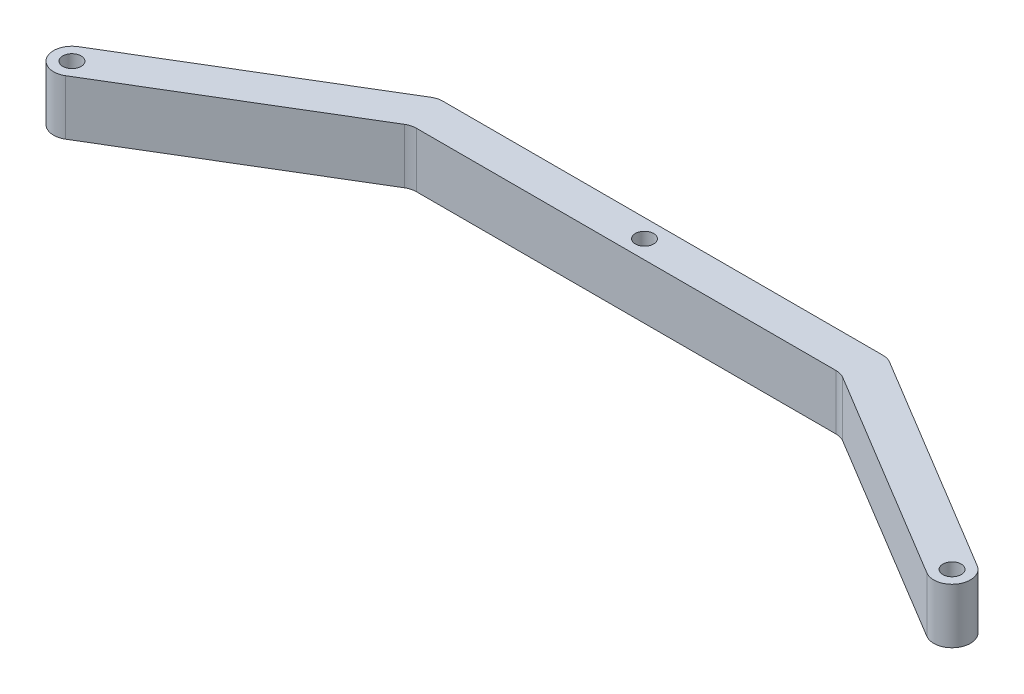
ISO-10303-21;
HEADER;
FILE_DESCRIPTION(('STEP AP214'),'2;1');
FILE_NAME('part.step','',(''),(''),'','','');
FILE_SCHEMA(('AUTOMOTIVE_DESIGN { 1 0 10303 214 1 1 1 1 }'));
ENDSEC;
DATA;
#1=APPLICATION_CONTEXT('core data for automotive mechanical design processes');
#2=APPLICATION_PROTOCOL_DEFINITION('international standard','automotive_design',2000,#1);
#3=PRODUCT_CONTEXT('',#1,'mechanical');
#4=PRODUCT('Part','Part','',(#3));
#5=PRODUCT_RELATED_PRODUCT_CATEGORY('part','',(#4));
#6=PRODUCT_DEFINITION_FORMATION('','',#4);
#7=PRODUCT_DEFINITION_CONTEXT('part definition',#1,'design');
#8=PRODUCT_DEFINITION('design','',#6,#7);
#9=PRODUCT_DEFINITION_SHAPE('','',#8);
#10=(LENGTH_UNIT() NAMED_UNIT(*) SI_UNIT(.MILLI.,.METRE.));
#11=(NAMED_UNIT(*) PLANE_ANGLE_UNIT() SI_UNIT($,.RADIAN.));
#12=(NAMED_UNIT(*) SI_UNIT($,.STERADIAN.) SOLID_ANGLE_UNIT());
#13=UNCERTAINTY_MEASURE_WITH_UNIT(LENGTH_MEASURE(1.E-05),#10,'distance_accuracy_value','');
#14=(GEOMETRIC_REPRESENTATION_CONTEXT(3) GLOBAL_UNCERTAINTY_ASSIGNED_CONTEXT((#13)) GLOBAL_UNIT_ASSIGNED_CONTEXT((#10,
#11,#12)) REPRESENTATION_CONTEXT('',''));
#15=CARTESIAN_POINT('',(0.,0.,0.));
#16=DIRECTION('',(0.,0.,1.));
#17=DIRECTION('',(1.,0.,0.));
#18=AXIS2_PLACEMENT_3D('',#15,#16,#17);
#19=CARTESIAN_POINT('',(-120.,15.,7.15836825076304));
#20=DIRECTION('',(0.,1.,0.));
#21=DIRECTION('',(0.,0.,1.));
#22=AXIS2_PLACEMENT_3D('',#19,#20,#21);
#23=PLANE('',#22);
#24=CARTESIAN_POINT('',(0.,15.,-28.9721608608683));
#25=DIRECTION('',(0.,1.,0.));
#26=DIRECTION('',(0.,0.,1.));
#27=AXIS2_PLACEMENT_3D('',#24,#25,#26);
#28=CIRCLE('',#27,2.5);
#29=CARTESIAN_POINT('',(0.,15.,-26.4721608608683));
#30=VERTEX_POINT('',#29);
#31=EDGE_CURVE('E321',#30,#30,#28,.T.);
#32=ORIENTED_EDGE('',*,*,#31,.F.);
#33=EDGE_LOOP('',(#32));
#34=FACE_BOUND('',#33,.T.);
#35=CARTESIAN_POINT('',(-120.,15.,7.15836825076304));
#36=DIRECTION('',(0.,1.,0.));
#37=DIRECTION('',(0.,0.,1.));
#38=AXIS2_PLACEMENT_3D('',#35,#36,#37);
#39=CIRCLE('',#38,2.50000000000001);
#40=CARTESIAN_POINT('',(-120.,15.,9.65836825076305));
#41=VERTEX_POINT('',#40);
#42=EDGE_CURVE('E173',#41,#41,#39,.T.);
#43=ORIENTED_EDGE('',*,*,#42,.F.);
#44=EDGE_LOOP('',(#43));
#45=FACE_BOUND('',#44,.T.);
#46=CARTESIAN_POINT('',(-120.,15.,7.15836825076304));
#47=DIRECTION('',(0.,1.,0.));
#48=DIRECTION('',(0.,0.,1.));
#49=AXIS2_PLACEMENT_3D('',#46,#47,#48);
#50=CIRCLE('',#49,4.99999999999999);
#51=CARTESIAN_POINT('',(-122.578302440189,15.,2.87440320341308));
#52=VERTEX_POINT('',#51);
#53=CARTESIAN_POINT('',(-117.421697559811,15.,11.442333298113));
#54=VERTEX_POINT('',#53);
#55=EDGE_CURVE('E203',#52,#54,#50,.T.);
#56=ORIENTED_EDGE('',*,*,#55,.T.);
#57=DIRECTION('',(0.856793009469994,0.,-0.515660488037771));
#58=VECTOR('',#57,1.);
#59=CARTESIAN_POINT('',(-59.7686526261322,15.,-23.2561259082183));
#60=LINE('',#59,#58);
#61=CARTESIAN_POINT('',(-59.7686526261322,15.,-23.2561259082183));
#62=VERTEX_POINT('',#61);
#63=EDGE_CURVE('E115',#54,#62,#60,.T.);
#64=ORIENTED_EDGE('',*,*,#63,.T.);
#65=CARTESIAN_POINT('',(-57.1903501859434,15.,-18.9721608608683));
#66=DIRECTION('',(0.,-1.,0.));
#67=DIRECTION('',(0.,0.,1.));
#68=AXIS2_PLACEMENT_3D('',#65,#66,#67);
#69=CIRCLE('',#68,5.);
#70=CARTESIAN_POINT('',(-57.1903501859434,15.,-23.9721608608683));
#71=VERTEX_POINT('',#70);
#72=EDGE_CURVE('E241',#62,#71,#69,.T.);
#73=ORIENTED_EDGE('',*,*,#72,.T.);
#74=DIRECTION('',(1.,0.,0.));
#75=VECTOR('',#74,1.);
#76=CARTESIAN_POINT('',(-57.1903501859434,15.,-23.9721608608683));
#77=LINE('',#76,#75);
#78=CARTESIAN_POINT('',(57.1903501859434,15.,-23.9721608608683));
#79=VERTEX_POINT('',#78);
#80=EDGE_CURVE('E261',#71,#79,#77,.T.);
#81=ORIENTED_EDGE('',*,*,#80,.T.);
#82=CARTESIAN_POINT('',(57.1903501859434,15.,-18.9721608608683));
#83=DIRECTION('',(0.,-1.,0.));
#84=DIRECTION('',(0.,0.,-1.));
#85=AXIS2_PLACEMENT_3D('',#82,#83,#84);
#86=CIRCLE('',#85,5.);
#87=CARTESIAN_POINT('',(59.7686526261322,15.,-23.2561259082183));
#88=VERTEX_POINT('',#87);
#89=EDGE_CURVE('E257',#79,#88,#86,.T.);
#90=ORIENTED_EDGE('',*,*,#89,.T.);
#91=DIRECTION('',(0.856793009469994,0.,0.515660488037771));
#92=VECTOR('',#91,1.);
#93=CARTESIAN_POINT('',(59.7686526261322,15.,-23.2561259082183));
#94=LINE('',#93,#92);
#95=CARTESIAN_POINT('',(117.421697559811,15.,11.442333298113));
#96=VERTEX_POINT('',#95);
#97=EDGE_CURVE('E260',#88,#96,#94,.T.);
#98=ORIENTED_EDGE('',*,*,#97,.T.);
#99=CARTESIAN_POINT('',(120.,15.,7.15836825076304));
#100=DIRECTION('',(0.,1.,0.));
#101=DIRECTION('',(0.,0.,-1.));
#102=AXIS2_PLACEMENT_3D('',#99,#100,#101);
#103=CIRCLE('',#102,4.99999999999999);
#104=CARTESIAN_POINT('',(122.578302440189,15.,2.87440320341308));
#105=VERTEX_POINT('',#104);
#106=EDGE_CURVE('E265',#96,#105,#103,.T.);
#107=ORIENTED_EDGE('',*,*,#106,.T.);
#108=DIRECTION('',(-0.856793009469993,0.,-0.515660488037771));
#109=VECTOR('',#108,1.);
#110=CARTESIAN_POINT('',(62.5458091826671,15.,-33.2561259082183));
#111=LINE('',#110,#109);
#112=CARTESIAN_POINT('',(62.5458091826671,15.,-33.2561259082183));
#113=VERTEX_POINT('',#112);
#114=EDGE_CURVE('E272',#105,#113,#111,.T.);
#115=ORIENTED_EDGE('',*,*,#114,.T.);
#116=CARTESIAN_POINT('',(59.9675067424783,15.,-28.9721608608683));
#117=DIRECTION('',(0.,1.,0.));
#118=DIRECTION('',(0.,0.,-1.));
#119=AXIS2_PLACEMENT_3D('',#116,#117,#118);
#120=CIRCLE('',#119,4.99999999999999);
#121=CARTESIAN_POINT('',(59.9675067424782,15.,-33.9721608608683));
#122=VERTEX_POINT('',#121);
#123=EDGE_CURVE('E146',#113,#122,#120,.T.);
#124=ORIENTED_EDGE('',*,*,#123,.T.);
#125=DIRECTION('',(-1.,0.,0.));
#126=VECTOR('',#125,1.);
#127=CARTESIAN_POINT('',(-59.9675067424782,15.,-33.9721608608683));
#128=LINE('',#127,#126);
#129=CARTESIAN_POINT('',(-59.9675067424782,15.,-33.9721608608683));
#130=VERTEX_POINT('',#129);
#131=EDGE_CURVE('E140',#122,#130,#128,.T.);
#132=ORIENTED_EDGE('',*,*,#131,.T.);
#133=CARTESIAN_POINT('',(-59.9675067424783,15.,-28.9721608608683));
#134=DIRECTION('',(0.,1.,0.));
#135=DIRECTION('',(0.,0.,1.));
#136=AXIS2_PLACEMENT_3D('',#133,#134,#135);
#137=CIRCLE('',#136,4.99999999999999);
#138=CARTESIAN_POINT('',(-62.5458091826671,15.,-33.2561259082183));
#139=VERTEX_POINT('',#138);
#140=EDGE_CURVE('E144',#130,#139,#137,.T.);
#141=ORIENTED_EDGE('',*,*,#140,.T.);
#142=DIRECTION('',(-0.856793009469993,0.,0.515660488037771));
#143=VECTOR('',#142,1.);
#144=CARTESIAN_POINT('',(-62.5458091826671,15.,-33.2561259082183));
#145=LINE('',#144,#143);
#146=EDGE_CURVE('E60',#139,#52,#145,.T.);
#147=ORIENTED_EDGE('',*,*,#146,.T.);
#148=EDGE_LOOP('',(#56,#64,#73,#81,#90,#98,#107,#115,#124,#132,#141,#147));
#149=FACE_BOUND('',#148,.T.);
#150=CARTESIAN_POINT('',(120.,15.,7.15836825076304));
#151=DIRECTION('',(0.,1.,0.));
#152=DIRECTION('',(0.,0.,-1.));
#153=AXIS2_PLACEMENT_3D('',#150,#151,#152);
#154=CIRCLE('',#153,2.50000000000001);
#155=CARTESIAN_POINT('',(120.,15.,4.65836825076303));
#156=VERTEX_POINT('',#155);
#157=EDGE_CURVE('E329',#156,#156,#154,.T.);
#158=ORIENTED_EDGE('',*,*,#157,.F.);
#159=EDGE_LOOP('',(#158));
#160=FACE_BOUND('',#159,.T.);
#161=ADVANCED_FACE('F41',(#34,#45,#149,#160),#23,.T.);
#162=CARTESIAN_POINT('',(-120.,0.,7.15836825076304));
#163=DIRECTION('',(0.,1.,0.));
#164=DIRECTION('',(0.,0.,1.));
#165=AXIS2_PLACEMENT_3D('',#162,#163,#164);
#166=PLANE('',#165);
#167=CARTESIAN_POINT('',(0.,0.,-28.9721608608683));
#168=DIRECTION('',(0.,1.,0.));
#169=DIRECTION('',(0.,0.,1.));
#170=AXIS2_PLACEMENT_3D('',#167,#168,#169);
#171=CIRCLE('',#170,2.5);
#172=CARTESIAN_POINT('',(0.,0.,-26.4721608608683));
#173=VERTEX_POINT('',#172);
#174=EDGE_CURVE('E45',#173,#173,#171,.T.);
#175=ORIENTED_EDGE('',*,*,#174,.T.);
#176=EDGE_LOOP('',(#175));
#177=FACE_BOUND('',#176,.T.);
#178=CARTESIAN_POINT('',(-120.,0.,7.15836825076304));
#179=DIRECTION('',(0.,1.,0.));
#180=DIRECTION('',(0.,0.,1.));
#181=AXIS2_PLACEMENT_3D('',#178,#179,#180);
#182=CIRCLE('',#181,4.99999999999999);
#183=CARTESIAN_POINT('',(-122.578302440189,0.,2.87440320341308));
#184=VERTEX_POINT('',#183);
#185=CARTESIAN_POINT('',(-117.421697559811,0.,11.442333298113));
#186=VERTEX_POINT('',#185);
#187=EDGE_CURVE('E168',#184,#186,#182,.T.);
#188=ORIENTED_EDGE('',*,*,#187,.F.);
#189=DIRECTION('',(-0.856793009469993,0.,0.515660488037771));
#190=VECTOR('',#189,1.);
#191=CARTESIAN_POINT('',(-62.5458091826671,0.,-33.2561259082183));
#192=LINE('',#191,#190);
#193=CARTESIAN_POINT('',(-62.5458091826671,0.,-33.2561259082183));
#194=VERTEX_POINT('',#193);
#195=EDGE_CURVE('E107',#194,#184,#192,.T.);
#196=ORIENTED_EDGE('',*,*,#195,.F.);
#197=CARTESIAN_POINT('',(-59.9675067424783,0.,-28.9721608608683));
#198=DIRECTION('',(0.,1.,0.));
#199=DIRECTION('',(0.,0.,1.));
#200=AXIS2_PLACEMENT_3D('',#197,#198,#199);
#201=CIRCLE('',#200,4.99999999999999);
#202=CARTESIAN_POINT('',(-59.9675067424782,0.,-33.9721608608683));
#203=VERTEX_POINT('',#202);
#204=EDGE_CURVE('E101',#203,#194,#201,.T.);
#205=ORIENTED_EDGE('',*,*,#204,.F.);
#206=DIRECTION('',(-1.,0.,0.));
#207=VECTOR('',#206,1.);
#208=CARTESIAN_POINT('',(-59.9675067424782,0.,-33.9721608608683));
#209=LINE('',#208,#207);
#210=CARTESIAN_POINT('',(59.9675067424782,0.,-33.9721608608683));
#211=VERTEX_POINT('',#210);
#212=EDGE_CURVE('E155',#211,#203,#209,.T.);
#213=ORIENTED_EDGE('',*,*,#212,.F.);
#214=CARTESIAN_POINT('',(59.9675067424783,0.,-28.9721608608683));
#215=DIRECTION('',(0.,1.,0.));
#216=DIRECTION('',(0.,0.,-1.));
#217=AXIS2_PLACEMENT_3D('',#214,#215,#216);
#218=CIRCLE('',#217,4.99999999999999);
#219=CARTESIAN_POINT('',(62.5458091826671,0.,-33.2561259082183));
#220=VERTEX_POINT('',#219);
#221=EDGE_CURVE('E194',#220,#211,#218,.T.);
#222=ORIENTED_EDGE('',*,*,#221,.F.);
#223=DIRECTION('',(-0.856793009469993,0.,-0.515660488037771));
#224=VECTOR('',#223,1.);
#225=CARTESIAN_POINT('',(62.5458091826671,0.,-33.2561259082183));
#226=LINE('',#225,#224);
#227=CARTESIAN_POINT('',(122.578302440189,0.,2.87440320341308));
#228=VERTEX_POINT('',#227);
#229=EDGE_CURVE('E191',#228,#220,#226,.T.);
#230=ORIENTED_EDGE('',*,*,#229,.F.);
#231=CARTESIAN_POINT('',(120.,0.,7.15836825076304));
#232=DIRECTION('',(0.,1.,0.));
#233=DIRECTION('',(0.,0.,-1.));
#234=AXIS2_PLACEMENT_3D('',#231,#232,#233);
#235=CIRCLE('',#234,4.99999999999999);
#236=CARTESIAN_POINT('',(117.421697559811,0.,11.442333298113));
#237=VERTEX_POINT('',#236);
#238=EDGE_CURVE('E188',#237,#228,#235,.T.);
#239=ORIENTED_EDGE('',*,*,#238,.F.);
#240=DIRECTION('',(0.856793009469994,0.,0.515660488037771));
#241=VECTOR('',#240,1.);
#242=CARTESIAN_POINT('',(59.7686526261322,0.,-23.2561259082183));
#243=LINE('',#242,#241);
#244=CARTESIAN_POINT('',(59.7686526261322,0.,-23.2561259082183));
#245=VERTEX_POINT('',#244);
#246=EDGE_CURVE('E185',#245,#237,#243,.T.);
#247=ORIENTED_EDGE('',*,*,#246,.F.);
#248=CARTESIAN_POINT('',(57.1903501859434,0.,-18.9721608608683));
#249=DIRECTION('',(0.,-1.,0.));
#250=DIRECTION('',(0.,0.,-1.));
#251=AXIS2_PLACEMENT_3D('',#248,#249,#250);
#252=CIRCLE('',#251,5.);
#253=CARTESIAN_POINT('',(57.1903501859434,0.,-23.9721608608683));
#254=VERTEX_POINT('',#253);
#255=EDGE_CURVE('E182',#254,#245,#252,.T.);
#256=ORIENTED_EDGE('',*,*,#255,.F.);
#257=DIRECTION('',(1.,0.,0.));
#258=VECTOR('',#257,1.);
#259=CARTESIAN_POINT('',(-57.1903501859434,0.,-23.9721608608683));
#260=LINE('',#259,#258);
#261=CARTESIAN_POINT('',(-57.1903501859434,0.,-23.9721608608683));
#262=VERTEX_POINT('',#261);
#263=EDGE_CURVE('E179',#262,#254,#260,.T.);
#264=ORIENTED_EDGE('',*,*,#263,.F.);
#265=CARTESIAN_POINT('',(-57.1903501859434,0.,-18.9721608608683));
#266=DIRECTION('',(0.,-1.,0.));
#267=DIRECTION('',(0.,0.,1.));
#268=AXIS2_PLACEMENT_3D('',#265,#266,#267);
#269=CIRCLE('',#268,5.);
#270=CARTESIAN_POINT('',(-59.7686526261322,0.,-23.2561259082183));
#271=VERTEX_POINT('',#270);
#272=EDGE_CURVE('E176',#271,#262,#269,.T.);
#273=ORIENTED_EDGE('',*,*,#272,.F.);
#274=DIRECTION('',(0.856793009469994,0.,-0.515660488037771));
#275=VECTOR('',#274,1.);
#276=CARTESIAN_POINT('',(-59.7686526261322,0.,-23.2561259082183));
#277=LINE('',#276,#275);
#278=EDGE_CURVE('E172',#186,#271,#277,.T.);
#279=ORIENTED_EDGE('',*,*,#278,.F.);
#280=EDGE_LOOP('',(#188,#196,#205,#213,#222,#230,#239,#247,#256,#264,#273,#279));
#281=FACE_BOUND('',#280,.T.);
#282=CARTESIAN_POINT('',(-120.,0.,7.15836825076304));
#283=DIRECTION('',(0.,1.,0.));
#284=DIRECTION('',(0.,0.,1.));
#285=AXIS2_PLACEMENT_3D('',#282,#283,#284);
#286=CIRCLE('',#285,2.50000000000001);
#287=CARTESIAN_POINT('',(-120.,0.,9.65836825076305));
#288=VERTEX_POINT('',#287);
#289=EDGE_CURVE('E335',#288,#288,#286,.T.);
#290=ORIENTED_EDGE('',*,*,#289,.T.);
#291=EDGE_LOOP('',(#290));
#292=FACE_BOUND('',#291,.T.);
#293=CARTESIAN_POINT('',(120.,0.,7.15836825076304));
#294=DIRECTION('',(0.,1.,0.));
#295=DIRECTION('',(0.,0.,-1.));
#296=AXIS2_PLACEMENT_3D('',#293,#294,#295);
#297=CIRCLE('',#296,2.50000000000001);
#298=CARTESIAN_POINT('',(120.,0.,4.65836825076303));
#299=VERTEX_POINT('',#298);
#300=EDGE_CURVE('E325',#299,#299,#297,.T.);
#301=ORIENTED_EDGE('',*,*,#300,.T.);
#302=EDGE_LOOP('',(#301));
#303=FACE_BOUND('',#302,.T.);
#304=ADVANCED_FACE('F245',(#177,#281,#292,#303),#166,.F.);
#305=CARTESIAN_POINT('',(-120.,15.,7.15836825076304));
#306=DIRECTION('',(0.,-1.,0.));
#307=DIRECTION('',(0.,0.,-1.));
#308=AXIS2_PLACEMENT_3D('',#305,#306,#307);
#309=CYLINDRICAL_SURFACE('',#308,4.99999999999999);
#310=ORIENTED_EDGE('',*,*,#187,.T.);
#311=DIRECTION('',(0.,-1.,0.));
#312=VECTOR('',#311,1.);
#313=CARTESIAN_POINT('',(-117.421697559811,15.,11.442333298113));
#314=LINE('',#313,#312);
#315=EDGE_CURVE('E11',#54,#186,#314,.T.);
#316=ORIENTED_EDGE('',*,*,#315,.F.);
#317=ORIENTED_EDGE('',*,*,#55,.F.);
#318=DIRECTION('',(0.,-1.,0.));
#319=VECTOR('',#318,1.);
#320=CARTESIAN_POINT('',(-122.578302440189,15.,2.87440320341308));
#321=LINE('',#320,#319);
#322=EDGE_CURVE('E164',#52,#184,#321,.T.);
#323=ORIENTED_EDGE('',*,*,#322,.T.);
#324=EDGE_LOOP('',(#310,#316,#317,#323));
#325=FACE_BOUND('',#324,.T.);
#326=ADVANCED_FACE('F43',(#325),#309,.T.);
#327=CARTESIAN_POINT('',(-59.7686526261322,15.,-23.2561259082183));
#328=DIRECTION('',(-0.51566048803777,0.,-0.856793009469993));
#329=DIRECTION('',(-0.856793009469994,0.,0.515660488037771));
#330=AXIS2_PLACEMENT_3D('',#327,#328,#329);
#331=PLANE('',#330);
#332=ORIENTED_EDGE('',*,*,#278,.T.);
#333=DIRECTION('',(0.,-1.,0.));
#334=VECTOR('',#333,1.);
#335=CARTESIAN_POINT('',(-59.7686526261322,15.,-23.2561259082183));
#336=LINE('',#335,#334);
#337=EDGE_CURVE('E52',#62,#271,#336,.T.);
#338=ORIENTED_EDGE('',*,*,#337,.F.);
#339=ORIENTED_EDGE('',*,*,#63,.F.);
#340=ORIENTED_EDGE('',*,*,#315,.T.);
#341=EDGE_LOOP('',(#332,#338,#339,#340));
#342=FACE_BOUND('',#341,.T.);
#343=ADVANCED_FACE('F442',(#342),#331,.F.);
#344=CARTESIAN_POINT('',(-57.1903501859434,15.,-18.9721608608683));
#345=DIRECTION('',(0.,-1.,0.));
#346=DIRECTION('',(0.,0.,-1.));
#347=AXIS2_PLACEMENT_3D('',#344,#345,#346);
#348=CYLINDRICAL_SURFACE('',#347,5.);
#349=ORIENTED_EDGE('',*,*,#272,.T.);
#350=DIRECTION('',(0.,-1.,0.));
#351=VECTOR('',#350,1.);
#352=CARTESIAN_POINT('',(-57.1903501859434,15.,-23.9721608608683));
#353=LINE('',#352,#351);
#354=EDGE_CURVE('E230',#71,#262,#353,.T.);
#355=ORIENTED_EDGE('',*,*,#354,.F.);
#356=ORIENTED_EDGE('',*,*,#72,.F.);
#357=ORIENTED_EDGE('',*,*,#337,.T.);
#358=EDGE_LOOP('',(#349,#355,#356,#357));
#359=FACE_BOUND('',#358,.T.);
#360=ADVANCED_FACE('F239',(#359),#348,.F.);
#361=CARTESIAN_POINT('',(-57.1903501859434,15.,-23.9721608608683));
#362=DIRECTION('',(0.,0.,-1.));
#363=DIRECTION('',(-1.,0.,0.));
#364=AXIS2_PLACEMENT_3D('',#361,#362,#363);
#365=PLANE('',#364);
#366=ORIENTED_EDGE('',*,*,#263,.T.);
#367=DIRECTION('',(0.,-1.,0.));
#368=VECTOR('',#367,1.);
#369=CARTESIAN_POINT('',(57.1903501859434,15.,-23.9721608608683));
#370=LINE('',#369,#368);
#371=EDGE_CURVE('E226',#79,#254,#370,.T.);
#372=ORIENTED_EDGE('',*,*,#371,.F.);
#373=ORIENTED_EDGE('',*,*,#80,.F.);
#374=ORIENTED_EDGE('',*,*,#354,.T.);
#375=EDGE_LOOP('',(#366,#372,#373,#374));
#376=FACE_BOUND('',#375,.T.);
#377=ADVANCED_FACE('F251',(#376),#365,.F.);
#378=CARTESIAN_POINT('',(57.1903501859434,15.,-18.9721608608683));
#379=DIRECTION('',(0.,-1.,0.));
#380=DIRECTION('',(0.,0.,-1.));
#381=AXIS2_PLACEMENT_3D('',#378,#379,#380);
#382=CYLINDRICAL_SURFACE('',#381,5.);
#383=ORIENTED_EDGE('',*,*,#255,.T.);
#384=DIRECTION('',(0.,-1.,0.));
#385=VECTOR('',#384,1.);
#386=CARTESIAN_POINT('',(59.7686526261322,15.,-23.2561259082183));
#387=LINE('',#386,#385);
#388=EDGE_CURVE('E222',#88,#245,#387,.T.);
#389=ORIENTED_EDGE('',*,*,#388,.F.);
#390=ORIENTED_EDGE('',*,*,#89,.F.);
#391=ORIENTED_EDGE('',*,*,#371,.T.);
#392=EDGE_LOOP('',(#383,#389,#390,#391));
#393=FACE_BOUND('',#392,.T.);
#394=ADVANCED_FACE('F255',(#393),#382,.F.);
#395=CARTESIAN_POINT('',(59.7686526261322,15.,-23.2561259082183));
#396=DIRECTION('',(0.51566048803777,0.,-0.856793009469993));
#397=DIRECTION('',(-0.856793009469994,0.,-0.515660488037771));
#398=AXIS2_PLACEMENT_3D('',#395,#396,#397);
#399=PLANE('',#398);
#400=ORIENTED_EDGE('',*,*,#246,.T.);
#401=DIRECTION('',(0.,-1.,0.));
#402=VECTOR('',#401,1.);
#403=CARTESIAN_POINT('',(117.421697559811,15.,11.442333298113));
#404=LINE('',#403,#402);
#405=EDGE_CURVE('E218',#96,#237,#404,.T.);
#406=ORIENTED_EDGE('',*,*,#405,.F.);
#407=ORIENTED_EDGE('',*,*,#97,.F.);
#408=ORIENTED_EDGE('',*,*,#388,.T.);
#409=EDGE_LOOP('',(#400,#406,#407,#408));
#410=FACE_BOUND('',#409,.T.);
#411=ADVANCED_FACE('F407',(#410),#399,.F.);
#412=CARTESIAN_POINT('',(120.,15.,7.15836825076304));
#413=DIRECTION('',(0.,-1.,0.));
#414=DIRECTION('',(0.,0.,-1.));
#415=AXIS2_PLACEMENT_3D('',#412,#413,#414);
#416=CYLINDRICAL_SURFACE('',#415,4.99999999999999);
#417=ORIENTED_EDGE('',*,*,#238,.T.);
#418=DIRECTION('',(0.,-1.,0.));
#419=VECTOR('',#418,1.);
#420=CARTESIAN_POINT('',(122.578302440189,15.,2.87440320341308));
#421=LINE('',#420,#419);
#422=EDGE_CURVE('E214',#105,#228,#421,.T.);
#423=ORIENTED_EDGE('',*,*,#422,.F.);
#424=ORIENTED_EDGE('',*,*,#106,.F.);
#425=ORIENTED_EDGE('',*,*,#405,.T.);
#426=EDGE_LOOP('',(#417,#423,#424,#425));
#427=FACE_BOUND('',#426,.T.);
#428=ADVANCED_FACE('F398',(#427),#416,.T.);
#429=CARTESIAN_POINT('',(62.5458091826671,15.,-33.2561259082183));
#430=DIRECTION('',(-0.515660488037771,0.,0.856793009469993));
#431=DIRECTION('',(0.856793009469994,0.,0.515660488037771));
#432=AXIS2_PLACEMENT_3D('',#429,#430,#431);
#433=PLANE('',#432);
#434=ORIENTED_EDGE('',*,*,#229,.T.);
#435=DIRECTION('',(0.,-1.,0.));
#436=VECTOR('',#435,1.);
#437=CARTESIAN_POINT('',(62.5458091826671,15.,-33.2561259082183));
#438=LINE('',#437,#436);
#439=EDGE_CURVE('E210',#113,#220,#438,.T.);
#440=ORIENTED_EDGE('',*,*,#439,.F.);
#441=ORIENTED_EDGE('',*,*,#114,.F.);
#442=ORIENTED_EDGE('',*,*,#422,.T.);
#443=EDGE_LOOP('',(#434,#440,#441,#442));
#444=FACE_BOUND('',#443,.T.);
#445=ADVANCED_FACE('F280',(#444),#433,.F.);
#446=CARTESIAN_POINT('',(59.9675067424783,15.,-28.9721608608683));
#447=DIRECTION('',(0.,-1.,0.));
#448=DIRECTION('',(0.,0.,-1.));
#449=AXIS2_PLACEMENT_3D('',#446,#447,#448);
#450=CYLINDRICAL_SURFACE('',#449,4.99999999999999);
#451=ORIENTED_EDGE('',*,*,#221,.T.);
#452=DIRECTION('',(0.,-1.,0.));
#453=VECTOR('',#452,1.);
#454=CARTESIAN_POINT('',(59.9675067424782,15.,-33.9721608608683));
#455=LINE('',#454,#453);
#456=EDGE_CURVE('E157',#122,#211,#455,.T.);
#457=ORIENTED_EDGE('',*,*,#456,.F.);
#458=ORIENTED_EDGE('',*,*,#123,.F.);
#459=ORIENTED_EDGE('',*,*,#439,.T.);
#460=EDGE_LOOP('',(#451,#457,#458,#459));
#461=FACE_BOUND('',#460,.T.);
#462=ADVANCED_FACE('F284',(#461),#450,.T.);
#463=CARTESIAN_POINT('',(-59.9675067424782,15.,-33.9721608608683));
#464=DIRECTION('',(0.,0.,1.));
#465=DIRECTION('',(1.,0.,0.));
#466=AXIS2_PLACEMENT_3D('',#463,#464,#465);
#467=PLANE('',#466);
#468=ORIENTED_EDGE('',*,*,#212,.T.);
#469=DIRECTION('',(0.,-1.,0.));
#470=VECTOR('',#469,1.);
#471=CARTESIAN_POINT('',(-59.9675067424782,15.,-33.9721608608683));
#472=LINE('',#471,#470);
#473=EDGE_CURVE('E152',#130,#203,#472,.T.);
#474=ORIENTED_EDGE('',*,*,#473,.F.);
#475=ORIENTED_EDGE('',*,*,#131,.F.);
#476=ORIENTED_EDGE('',*,*,#456,.T.);
#477=EDGE_LOOP('',(#468,#474,#475,#476));
#478=FACE_BOUND('',#477,.T.);
#479=ADVANCED_FACE('F153',(#478),#467,.F.);
#480=CARTESIAN_POINT('',(-59.9675067424783,15.,-28.9721608608683));
#481=DIRECTION('',(0.,-1.,0.));
#482=DIRECTION('',(0.,0.,-1.));
#483=AXIS2_PLACEMENT_3D('',#480,#481,#482);
#484=CYLINDRICAL_SURFACE('',#483,4.99999999999999);
#485=ORIENTED_EDGE('',*,*,#204,.T.);
#486=DIRECTION('',(0.,-1.,0.));
#487=VECTOR('',#486,1.);
#488=CARTESIAN_POINT('',(-62.5458091826671,15.,-33.2561259082183));
#489=LINE('',#488,#487);
#490=EDGE_CURVE('E158',#139,#194,#489,.T.);
#491=ORIENTED_EDGE('',*,*,#490,.F.);
#492=ORIENTED_EDGE('',*,*,#140,.F.);
#493=ORIENTED_EDGE('',*,*,#473,.T.);
#494=EDGE_LOOP('',(#485,#491,#492,#493));
#495=FACE_BOUND('',#494,.T.);
#496=ADVANCED_FACE('F160',(#495),#484,.T.);
#497=CARTESIAN_POINT('',(-62.5458091826671,15.,-33.2561259082183));
#498=DIRECTION('',(0.515660488037771,0.,0.856793009469993));
#499=DIRECTION('',(0.856793009469994,0.,-0.515660488037771));
#500=AXIS2_PLACEMENT_3D('',#497,#498,#499);
#501=PLANE('',#500);
#502=ORIENTED_EDGE('',*,*,#195,.T.);
#503=ORIENTED_EDGE('',*,*,#322,.F.);
#504=ORIENTED_EDGE('',*,*,#146,.F.);
#505=ORIENTED_EDGE('',*,*,#490,.T.);
#506=EDGE_LOOP('',(#502,#503,#504,#505));
#507=FACE_BOUND('',#506,.T.);
#508=ADVANCED_FACE('F288',(#507),#501,.F.);
#509=CARTESIAN_POINT('',(-120.,15.,7.15836825076304));
#510=DIRECTION('',(0.,-1.,0.));
#511=DIRECTION('',(0.,0.,-1.));
#512=AXIS2_PLACEMENT_3D('',#509,#510,#511);
#513=CYLINDRICAL_SURFACE('',#512,2.50000000000001);
#514=ORIENTED_EDGE('',*,*,#42,.T.);
#515=EDGE_LOOP('',(#514));
#516=FACE_BOUND('',#515,.T.);
#517=ORIENTED_EDGE('',*,*,#289,.F.);
#518=EDGE_LOOP('',(#517));
#519=FACE_BOUND('',#518,.T.);
#520=ADVANCED_FACE('F290',(#516,#519),#513,.F.);
#521=CARTESIAN_POINT('',(120.,15.,7.15836825076304));
#522=DIRECTION('',(0.,-1.,0.));
#523=DIRECTION('',(0.,0.,-1.));
#524=AXIS2_PLACEMENT_3D('',#521,#522,#523);
#525=CYLINDRICAL_SURFACE('',#524,2.50000000000001);
#526=ORIENTED_EDGE('',*,*,#157,.T.);
#527=EDGE_LOOP('',(#526));
#528=FACE_BOUND('',#527,.T.);
#529=ORIENTED_EDGE('',*,*,#300,.F.);
#530=EDGE_LOOP('',(#529));
#531=FACE_BOUND('',#530,.T.);
#532=ADVANCED_FACE('F296',(#528,#531),#525,.F.);
#533=CARTESIAN_POINT('',(0.,-5.,-28.9721608608683));
#534=DIRECTION('',(0.,1.,0.));
#535=DIRECTION('',(0.,0.,1.));
#536=AXIS2_PLACEMENT_3D('',#533,#534,#535);
#537=CYLINDRICAL_SURFACE('',#536,2.5);
#538=ORIENTED_EDGE('',*,*,#31,.T.);
#539=EDGE_LOOP('',(#538));
#540=FACE_BOUND('',#539,.T.);
#541=ORIENTED_EDGE('',*,*,#174,.F.);
#542=EDGE_LOOP('',(#541));
#543=FACE_BOUND('',#542,.T.);
#544=ADVANCED_FACE('F313',(#540,#543),#537,.F.);
#545=CLOSED_SHELL('',(#161,#304,#326,#343,#360,#377,#394,#411,#428,#445,#462,#479,#496,#508,
#520,#532,#544));
#546=MANIFOLD_SOLID_BREP('B2',#545);
#547=ADVANCED_BREP_SHAPE_REPRESENTATION('',(#18,#546),#14);
#548=SHAPE_DEFINITION_REPRESENTATION(#9,#547);
ENDSEC;
END-ISO-10303-21;
